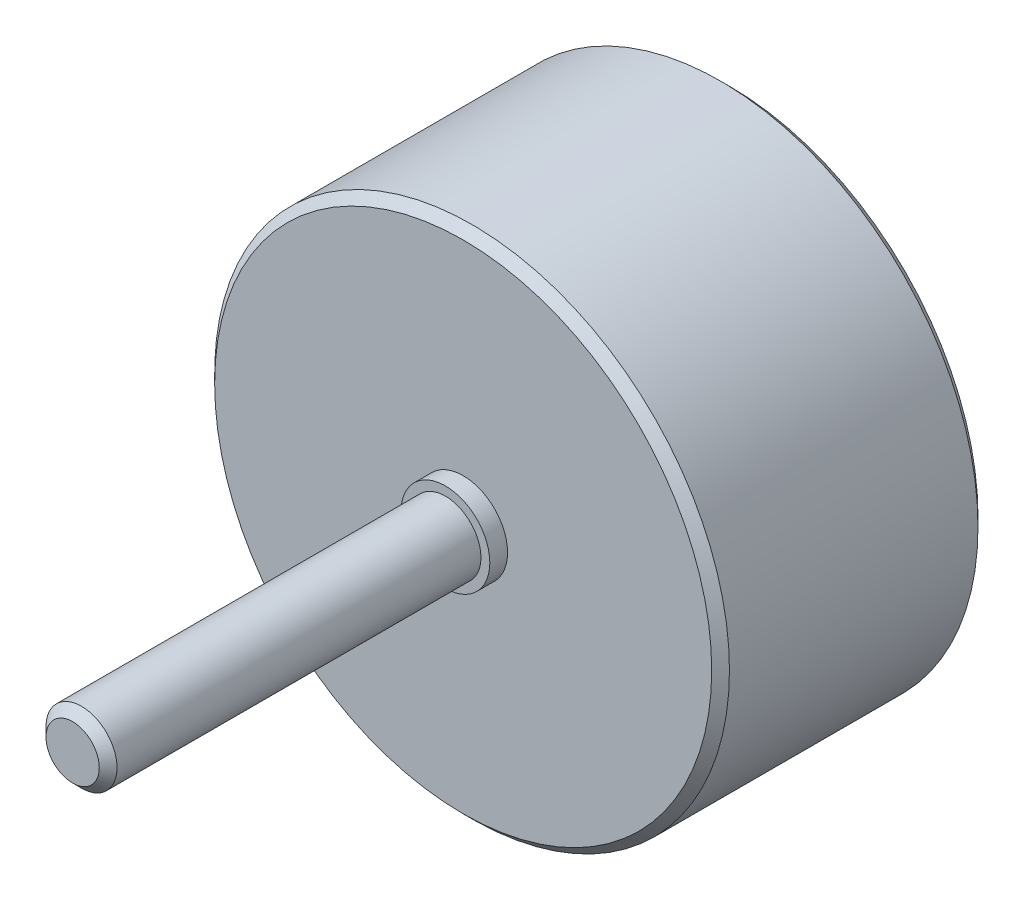
ISO-10303-21;
HEADER;
FILE_DESCRIPTION(('STEP AP214'),'2;1');
FILE_NAME('part.step','',(''),(''),'','','');
FILE_SCHEMA(('AUTOMOTIVE_DESIGN { 1 0 10303 214 1 1 1 1 }'));
ENDSEC;
DATA;
#1=APPLICATION_CONTEXT('core data for automotive mechanical design processes');
#2=APPLICATION_PROTOCOL_DEFINITION('international standard','automotive_design',2000,#1);
#3=PRODUCT_CONTEXT('',#1,'mechanical');
#4=PRODUCT('Part','Part','',(#3));
#5=PRODUCT_RELATED_PRODUCT_CATEGORY('part','',(#4));
#6=PRODUCT_DEFINITION_FORMATION('','',#4);
#7=PRODUCT_DEFINITION_CONTEXT('part definition',#1,'design');
#8=PRODUCT_DEFINITION('design','',#6,#7);
#9=PRODUCT_DEFINITION_SHAPE('','',#8);
#10=(LENGTH_UNIT() NAMED_UNIT(*) SI_UNIT(.MILLI.,.METRE.));
#11=(NAMED_UNIT(*) PLANE_ANGLE_UNIT() SI_UNIT($,.RADIAN.));
#12=(NAMED_UNIT(*) SI_UNIT($,.STERADIAN.) SOLID_ANGLE_UNIT());
#13=UNCERTAINTY_MEASURE_WITH_UNIT(LENGTH_MEASURE(1.E-05),#10,'distance_accuracy_value','');
#14=(GEOMETRIC_REPRESENTATION_CONTEXT(3) GLOBAL_UNCERTAINTY_ASSIGNED_CONTEXT((#13)) GLOBAL_UNIT_ASSIGNED_CONTEXT((#10,
#11,#12)) REPRESENTATION_CONTEXT('',''));
#15=CARTESIAN_POINT('',(0.,0.,0.));
#16=DIRECTION('',(0.,0.,1.));
#17=DIRECTION('',(1.,0.,0.));
#18=AXIS2_PLACEMENT_3D('',#15,#16,#17);
#19=CARTESIAN_POINT('',(0.,0.,30.));
#20=DIRECTION('',(0.,0.,-1.));
#21=DIRECTION('',(-1.,0.,0.));
#22=AXIS2_PLACEMENT_3D('',#19,#20,#21);
#23=CYLINDRICAL_SURFACE('',#22,29.);
#24=CARTESIAN_POINT('',(0.,0.,29.));
#25=DIRECTION('',(0.,0.,1.));
#26=DIRECTION('',(1.,0.,0.));
#27=AXIS2_PLACEMENT_3D('',#24,#25,#26);
#28=CIRCLE('',#27,29.);
#29=CARTESIAN_POINT('',(29.,0.,29.));
#30=VERTEX_POINT('',#29);
#31=EDGE_CURVE('E49',#30,#30,#28,.F.);
#32=ORIENTED_EDGE('',*,*,#31,.T.);
#33=EDGE_LOOP('',(#32));
#34=FACE_BOUND('',#33,.T.);
#35=CARTESIAN_POINT('',(0.,0.,0.99999999999999));
#36=DIRECTION('',(0.,0.,1.));
#37=DIRECTION('',(1.,0.,0.));
#38=AXIS2_PLACEMENT_3D('',#35,#36,#37);
#39=CIRCLE('',#38,29.);
#40=CARTESIAN_POINT('',(29.,0.,0.99999999999999));
#41=VERTEX_POINT('',#40);
#42=EDGE_CURVE('E54',#41,#41,#39,.T.);
#43=ORIENTED_EDGE('',*,*,#42,.T.);
#44=EDGE_LOOP('',(#43));
#45=FACE_BOUND('',#44,.T.);
#46=ADVANCED_FACE('F34',(#34,#45),#23,.T.);
#47=CARTESIAN_POINT('',(0.,0.,30.));
#48=DIRECTION('',(0.,0.,1.));
#49=DIRECTION('',(1.,0.,0.));
#50=AXIS2_PLACEMENT_3D('',#47,#48,#49);
#51=PLANE('',#50);
#52=CARTESIAN_POINT('',(0.,0.,30.));
#53=DIRECTION('',(0.,0.,1.));
#54=DIRECTION('',(1.,0.,0.));
#55=AXIS2_PLACEMENT_3D('',#52,#53,#54);
#56=CIRCLE('',#55,28.);
#57=CARTESIAN_POINT('',(28.,0.,30.));
#58=VERTEX_POINT('',#57);
#59=EDGE_CURVE('E57',#58,#58,#56,.T.);
#60=ORIENTED_EDGE('',*,*,#59,.T.);
#61=EDGE_LOOP('',(#60));
#62=FACE_BOUND('',#61,.T.);
#63=CARTESIAN_POINT('',(0.,0.,30.));
#64=DIRECTION('',(0.,0.,1.));
#65=DIRECTION('',(1.,0.,0.));
#66=AXIS2_PLACEMENT_3D('',#63,#64,#65);
#67=CIRCLE('',#66,5.);
#68=CARTESIAN_POINT('',(5.,0.,30.));
#69=VERTEX_POINT('',#68);
#70=EDGE_CURVE('E64',#69,#69,#67,.T.);
#71=ORIENTED_EDGE('',*,*,#70,.F.);
#72=EDGE_LOOP('',(#71));
#73=FACE_BOUND('',#72,.T.);
#74=ADVANCED_FACE('F88',(#62,#73),#51,.T.);
#75=CARTESIAN_POINT('',(0.,0.,0.));
#76=DIRECTION('',(0.,0.,1.));
#77=DIRECTION('',(1.,0.,0.));
#78=AXIS2_PLACEMENT_3D('',#75,#76,#77);
#79=PLANE('',#78);
#80=CARTESIAN_POINT('',(0.,0.,0.));
#81=DIRECTION('',(0.,0.,1.));
#82=DIRECTION('',(1.,0.,0.));
#83=AXIS2_PLACEMENT_3D('',#80,#81,#82);
#84=CIRCLE('',#83,28.);
#85=CARTESIAN_POINT('',(28.,0.,0.));
#86=VERTEX_POINT('',#85);
#87=EDGE_CURVE('E45',#86,#86,#84,.F.);
#88=ORIENTED_EDGE('',*,*,#87,.T.);
#89=EDGE_LOOP('',(#88));
#90=FACE_BOUND('',#89,.T.);
#91=CARTESIAN_POINT('',(0.,0.,0.));
#92=DIRECTION('',(0.,0.,-1.));
#93=DIRECTION('',(-1.,0.,0.));
#94=AXIS2_PLACEMENT_3D('',#91,#92,#93);
#95=CIRCLE('',#94,4.);
#96=CARTESIAN_POINT('',(-4.,0.,0.));
#97=VERTEX_POINT('',#96);
#98=EDGE_CURVE('E70',#97,#97,#95,.T.);
#99=ORIENTED_EDGE('',*,*,#98,.F.);
#100=EDGE_LOOP('',(#99));
#101=FACE_BOUND('',#100,.T.);
#102=ADVANCED_FACE('F85',(#90,#101),#79,.F.);
#103=CARTESIAN_POINT('',(0.,0.,32.));
#104=DIRECTION('',(0.,0.,-1.));
#105=DIRECTION('',(-1.,0.,0.));
#106=AXIS2_PLACEMENT_3D('',#103,#104,#105);
#107=CYLINDRICAL_SURFACE('',#106,5.);
#108=CARTESIAN_POINT('',(0.,0.,32.));
#109=DIRECTION('',(0.,0.,1.));
#110=DIRECTION('',(1.,0.,0.));
#111=AXIS2_PLACEMENT_3D('',#108,#109,#110);
#112=CIRCLE('',#111,5.);
#113=CARTESIAN_POINT('',(5.,0.,32.));
#114=VERTEX_POINT('',#113);
#115=EDGE_CURVE('E63',#114,#114,#112,.T.);
#116=ORIENTED_EDGE('',*,*,#115,.F.);
#117=EDGE_LOOP('',(#116));
#118=FACE_BOUND('',#117,.T.);
#119=ORIENTED_EDGE('',*,*,#70,.T.);
#120=EDGE_LOOP('',(#119));
#121=FACE_BOUND('',#120,.T.);
#122=ADVANCED_FACE('F87',(#118,#121),#107,.T.);
#123=CARTESIAN_POINT('',(0.,0.,32.));
#124=DIRECTION('',(0.,0.,1.));
#125=DIRECTION('',(1.,0.,0.));
#126=AXIS2_PLACEMENT_3D('',#123,#124,#125);
#127=PLANE('',#126);
#128=CARTESIAN_POINT('',(0.,0.,32.));
#129=DIRECTION('',(0.,0.,1.));
#130=DIRECTION('',(1.,0.,0.));
#131=AXIS2_PLACEMENT_3D('',#128,#129,#130);
#132=CIRCLE('',#131,4.);
#133=CARTESIAN_POINT('',(4.,0.,32.));
#134=VERTEX_POINT('',#133);
#135=EDGE_CURVE('E60',#134,#134,#132,.T.);
#136=ORIENTED_EDGE('',*,*,#135,.F.);
#137=EDGE_LOOP('',(#136));
#138=FACE_BOUND('',#137,.T.);
#139=ORIENTED_EDGE('',*,*,#115,.T.);
#140=EDGE_LOOP('',(#139));
#141=FACE_BOUND('',#140,.T.);
#142=ADVANCED_FACE('F95',(#138,#141),#127,.T.);
#143=CARTESIAN_POINT('',(0.,0.,36.));
#144=DIRECTION('',(0.,0.,-1.));
#145=DIRECTION('',(-1.,0.,0.));
#146=AXIS2_PLACEMENT_3D('',#143,#144,#145);
#147=CYLINDRICAL_SURFACE('',#146,4.);
#148=CARTESIAN_POINT('',(0.,0.,73.));
#149=DIRECTION('',(0.,0.,1.));
#150=DIRECTION('',(1.,0.,0.));
#151=AXIS2_PLACEMENT_3D('',#148,#149,#150);
#152=CIRCLE('',#151,4.);
#153=CARTESIAN_POINT('',(4.,0.,73.));
#154=VERTEX_POINT('',#153);
#155=EDGE_CURVE('E10',#154,#154,#152,.F.);
#156=ORIENTED_EDGE('',*,*,#155,.T.);
#157=EDGE_LOOP('',(#156));
#158=FACE_BOUND('',#157,.T.);
#159=ORIENTED_EDGE('',*,*,#135,.T.);
#160=EDGE_LOOP('',(#159));
#161=FACE_BOUND('',#160,.T.);
#162=ADVANCED_FACE('F81',(#158,#161),#147,.T.);
#163=CARTESIAN_POINT('',(0.,0.,5.));
#164=DIRECTION('',(0.,0.,-1.));
#165=DIRECTION('',(-1.,0.,0.));
#166=AXIS2_PLACEMENT_3D('',#163,#164,#165);
#167=CYLINDRICAL_SURFACE('',#166,4.);
#168=CARTESIAN_POINT('',(0.,0.,5.));
#169=DIRECTION('',(0.,0.,-1.));
#170=DIRECTION('',(-1.,0.,0.));
#171=AXIS2_PLACEMENT_3D('',#168,#169,#170);
#172=CIRCLE('',#171,4.);
#173=CARTESIAN_POINT('',(-4.,0.,5.));
#174=VERTEX_POINT('',#173);
#175=EDGE_CURVE('E67',#174,#174,#172,.T.);
#176=ORIENTED_EDGE('',*,*,#175,.F.);
#177=EDGE_LOOP('',(#176));
#178=FACE_BOUND('',#177,.T.);
#179=ORIENTED_EDGE('',*,*,#98,.T.);
#180=EDGE_LOOP('',(#179));
#181=FACE_BOUND('',#180,.T.);
#182=ADVANCED_FACE('F78',(#178,#181),#167,.F.);
#183=CARTESIAN_POINT('',(0.,0.,5.));
#184=DIRECTION('',(0.,0.,-1.));
#185=DIRECTION('',(-1.,0.,0.));
#186=AXIS2_PLACEMENT_3D('',#183,#184,#185);
#187=PLANE('',#186);
#188=ORIENTED_EDGE('',*,*,#175,.T.);
#189=EDGE_LOOP('',(#188));
#190=FACE_BOUND('',#189,.T.);
#191=ADVANCED_FACE('F76',(#190),#187,.T.);
#192=CARTESIAN_POINT('',(0.,0.,30.));
#193=DIRECTION('',(0.,0.,-1.));
#194=DIRECTION('',(-1.,0.,0.));
#195=AXIS2_PLACEMENT_3D('',#192,#193,#194);
#196=CONICAL_SURFACE('',#195,28.,0.785398163397452);
#197=ORIENTED_EDGE('',*,*,#31,.F.);
#198=EDGE_LOOP('',(#197));
#199=FACE_BOUND('',#198,.T.);
#200=ORIENTED_EDGE('',*,*,#59,.F.);
#201=EDGE_LOOP('',(#200));
#202=FACE_BOUND('',#201,.T.);
#203=ADVANCED_FACE('F107',(#199,#202),#196,.T.);
#204=CARTESIAN_POINT('',(0.,0.,0.99999999999999));
#205=DIRECTION('',(0.,0.,1.));
#206=DIRECTION('',(1.,0.,0.));
#207=AXIS2_PLACEMENT_3D('',#204,#205,#206);
#208=CONICAL_SURFACE('',#207,29.,0.785398163397454);
#209=ORIENTED_EDGE('',*,*,#87,.F.);
#210=EDGE_LOOP('',(#209));
#211=FACE_BOUND('',#210,.T.);
#212=ORIENTED_EDGE('',*,*,#42,.F.);
#213=EDGE_LOOP('',(#212));
#214=FACE_BOUND('',#213,.T.);
#215=ADVANCED_FACE('F109',(#211,#214),#208,.T.);
#216=CARTESIAN_POINT('',(0.,0.,74.));
#217=DIRECTION('',(0.,0.,1.));
#218=DIRECTION('',(1.,0.,0.));
#219=AXIS2_PLACEMENT_3D('',#216,#217,#218);
#220=PLANE('',#219);
#221=CARTESIAN_POINT('',(0.,0.,74.));
#222=DIRECTION('',(0.,0.,1.));
#223=DIRECTION('',(1.,0.,0.));
#224=AXIS2_PLACEMENT_3D('',#221,#222,#223);
#225=CIRCLE('',#224,3.);
#226=CARTESIAN_POINT('',(3.,0.,74.));
#227=VERTEX_POINT('',#226);
#228=EDGE_CURVE('E41',#227,#227,#225,.T.);
#229=ORIENTED_EDGE('',*,*,#228,.T.);
#230=EDGE_LOOP('',(#229));
#231=FACE_BOUND('',#230,.T.);
#232=ADVANCED_FACE('F112',(#231),#220,.T.);
#233=CARTESIAN_POINT('',(0.,0.,74.));
#234=DIRECTION('',(0.,0.,-1.));
#235=DIRECTION('',(-1.,0.,0.));
#236=AXIS2_PLACEMENT_3D('',#233,#234,#235);
#237=CONICAL_SURFACE('',#236,3.,0.785398163397447);
#238=ORIENTED_EDGE('',*,*,#155,.F.);
#239=EDGE_LOOP('',(#238));
#240=FACE_BOUND('',#239,.T.);
#241=ORIENTED_EDGE('',*,*,#228,.F.);
#242=EDGE_LOOP('',(#241));
#243=FACE_BOUND('',#242,.T.);
#244=ADVANCED_FACE('F36',(#240,#243),#237,.T.);
#245=CLOSED_SHELL('',(#46,#74,#102,#122,#142,#162,#182,#191,#203,#215,#232,#244));
#246=MANIFOLD_SOLID_BREP('B2',#245);
#247=ADVANCED_BREP_SHAPE_REPRESENTATION('',(#18,#246),#14);
#248=SHAPE_DEFINITION_REPRESENTATION(#9,#247);
ENDSEC;
END-ISO-10303-21;
